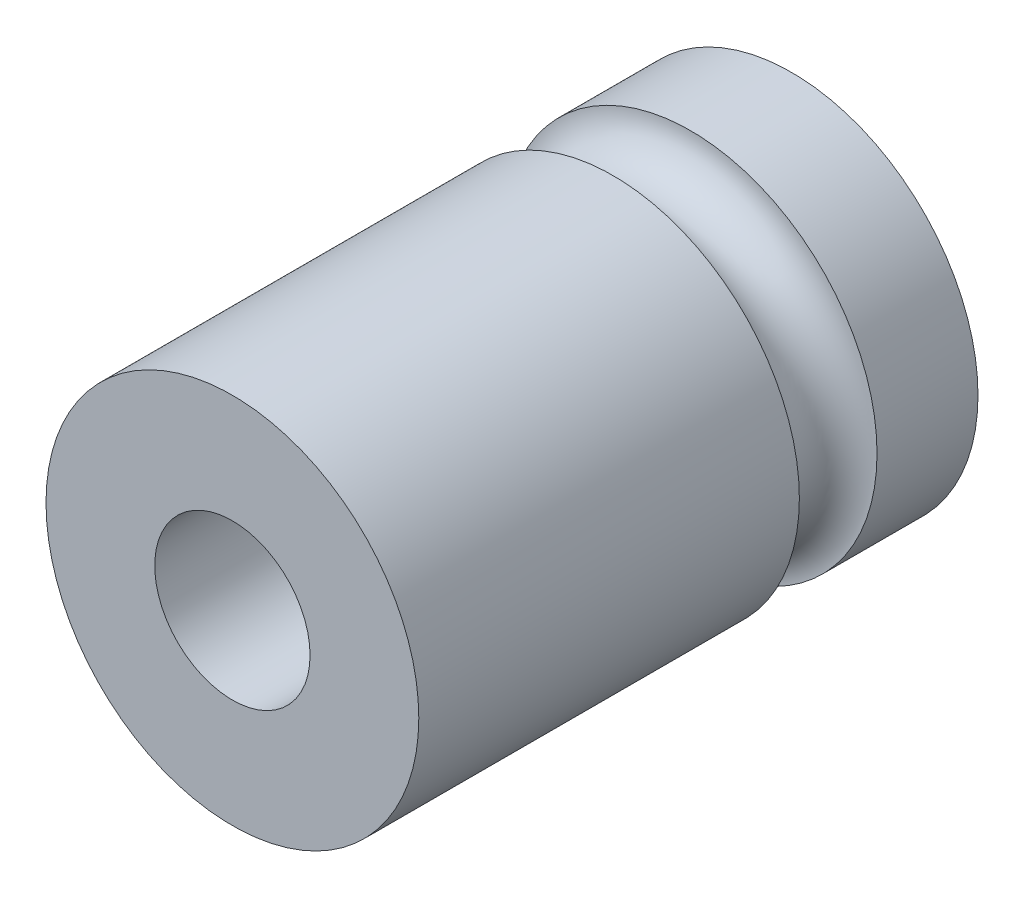
ISO-10303-21;
HEADER;
FILE_DESCRIPTION(('STEP AP214'),'2;1');
FILE_NAME('part.step','',(''),(''),'','','');
FILE_SCHEMA(('AUTOMOTIVE_DESIGN { 1 0 10303 214 1 1 1 1 }'));
ENDSEC;
DATA;
#1=APPLICATION_CONTEXT('core data for automotive mechanical design processes');
#2=APPLICATION_PROTOCOL_DEFINITION('international standard','automotive_design',2000,#1);
#3=PRODUCT_CONTEXT('',#1,'mechanical');
#4=PRODUCT('Part','Part','',(#3));
#5=PRODUCT_RELATED_PRODUCT_CATEGORY('part','',(#4));
#6=PRODUCT_DEFINITION_FORMATION('','',#4);
#7=PRODUCT_DEFINITION_CONTEXT('part definition',#1,'design');
#8=PRODUCT_DEFINITION('design','',#6,#7);
#9=PRODUCT_DEFINITION_SHAPE('','',#8);
#10=(LENGTH_UNIT() NAMED_UNIT(*) SI_UNIT(.MILLI.,.METRE.));
#11=(NAMED_UNIT(*) PLANE_ANGLE_UNIT() SI_UNIT($,.RADIAN.));
#12=(NAMED_UNIT(*) SI_UNIT($,.STERADIAN.) SOLID_ANGLE_UNIT());
#13=UNCERTAINTY_MEASURE_WITH_UNIT(LENGTH_MEASURE(1.E-05),#10,'distance_accuracy_value','');
#14=(GEOMETRIC_REPRESENTATION_CONTEXT(3) GLOBAL_UNCERTAINTY_ASSIGNED_CONTEXT((#13)) GLOBAL_UNIT_ASSIGNED_CONTEXT((#10,
#11,#12)) REPRESENTATION_CONTEXT('',''));
#15=CARTESIAN_POINT('',(0.,0.,0.));
#16=DIRECTION('',(0.,0.,1.));
#17=DIRECTION('',(1.,0.,0.));
#18=AXIS2_PLACEMENT_3D('',#15,#16,#17);
#19=CARTESIAN_POINT('',(0.,0.,5.715));
#20=DIRECTION('',(0.,0.,-1.));
#21=DIRECTION('',(-1.,0.,0.));
#22=AXIS2_PLACEMENT_3D('',#19,#20,#21);
#23=CYLINDRICAL_SURFACE('',#22,3.81);
#24=CARTESIAN_POINT('',(0.,0.,-2.06375));
#25=DIRECTION('',(0.,0.,-1.));
#26=DIRECTION('',(-1.,0.,0.));
#27=AXIS2_PLACEMENT_3D('',#24,#25,#26);
#28=CIRCLE('',#27,3.81);
#29=CARTESIAN_POINT('',(-3.81,0.,-2.06375));
#30=VERTEX_POINT('',#29);
#31=EDGE_CURVE('E37',#30,#30,#28,.F.);
#32=ORIENTED_EDGE('',*,*,#31,.T.);
#33=EDGE_LOOP('',(#32));
#34=FACE_BOUND('',#33,.T.);
#35=CARTESIAN_POINT('',(0.,0.,5.715));
#36=DIRECTION('',(0.,0.,1.));
#37=DIRECTION('',(1.,0.,0.));
#38=AXIS2_PLACEMENT_3D('',#35,#36,#37);
#39=CIRCLE('',#38,3.81);
#40=CARTESIAN_POINT('',(3.81,0.,5.715));
#41=VERTEX_POINT('',#40);
#42=EDGE_CURVE('E10',#41,#41,#39,.T.);
#43=ORIENTED_EDGE('',*,*,#42,.F.);
#44=EDGE_LOOP('',(#43));
#45=FACE_BOUND('',#44,.T.);
#46=ADVANCED_FACE('F33',(#34,#45),#23,.T.);
#47=CARTESIAN_POINT('',(0.,0.,5.715));
#48=DIRECTION('',(0.,0.,1.));
#49=DIRECTION('',(1.,0.,0.));
#50=AXIS2_PLACEMENT_3D('',#47,#48,#49);
#51=PLANE('',#50);
#52=ORIENTED_EDGE('',*,*,#42,.T.);
#53=EDGE_LOOP('',(#52));
#54=FACE_BOUND('',#53,.T.);
#55=CARTESIAN_POINT('',(0.,0.,5.715));
#56=DIRECTION('',(0.,0.,1.));
#57=DIRECTION('',(1.,0.,0.));
#58=AXIS2_PLACEMENT_3D('',#55,#56,#57);
#59=CIRCLE('',#58,1.5875);
#60=CARTESIAN_POINT('',(1.5875,0.,5.715));
#61=VERTEX_POINT('',#60);
#62=EDGE_CURVE('E46',#61,#61,#59,.T.);
#63=ORIENTED_EDGE('',*,*,#62,.F.);
#64=EDGE_LOOP('',(#63));
#65=FACE_BOUND('',#64,.T.);
#66=ADVANCED_FACE('F67',(#54,#65),#51,.T.);
#67=CARTESIAN_POINT('',(0.,0.,-5.715));
#68=DIRECTION('',(0.,0.,1.));
#69=DIRECTION('',(1.,0.,0.));
#70=AXIS2_PLACEMENT_3D('',#67,#68,#69);
#71=PLANE('',#70);
#72=CARTESIAN_POINT('',(0.,0.,-5.715));
#73=DIRECTION('',(0.,0.,1.));
#74=DIRECTION('',(1.,0.,0.));
#75=AXIS2_PLACEMENT_3D('',#72,#73,#74);
#76=CIRCLE('',#75,3.81);
#77=CARTESIAN_POINT('',(3.81,0.,-5.715));
#78=VERTEX_POINT('',#77);
#79=EDGE_CURVE('E41',#78,#78,#76,.T.);
#80=ORIENTED_EDGE('',*,*,#79,.F.);
#81=EDGE_LOOP('',(#80));
#82=FACE_BOUND('',#81,.T.);
#83=CARTESIAN_POINT('',(0.,0.,-5.715));
#84=DIRECTION('',(0.,0.,1.));
#85=DIRECTION('',(1.,0.,0.));
#86=AXIS2_PLACEMENT_3D('',#83,#84,#85);
#87=CIRCLE('',#86,1.5875);
#88=CARTESIAN_POINT('',(1.5875,0.,-5.715));
#89=VERTEX_POINT('',#88);
#90=EDGE_CURVE('E49',#89,#89,#87,.T.);
#91=ORIENTED_EDGE('',*,*,#90,.T.);
#92=EDGE_LOOP('',(#91));
#93=FACE_BOUND('',#92,.T.);
#94=ADVANCED_FACE('F69',(#82,#93),#71,.F.);
#95=CARTESIAN_POINT('',(0.,0.,-3.65125));
#96=DIRECTION('',(0.,0.,1.));
#97=DIRECTION('',(1.,0.,0.));
#98=AXIS2_PLACEMENT_3D('',#95,#96,#97);
#99=CIRCLE('',#98,3.81);
#100=CARTESIAN_POINT('',(3.81,0.,-3.65125));
#101=VERTEX_POINT('',#100);
#102=EDGE_CURVE('E51',#101,#101,#99,.F.);
#103=ORIENTED_EDGE('',*,*,#102,.T.);
#104=EDGE_LOOP('',(#103));
#105=FACE_BOUND('',#104,.T.);
#106=ORIENTED_EDGE('',*,*,#79,.T.);
#107=EDGE_LOOP('',(#106));
#108=FACE_BOUND('',#107,.T.);
#109=ADVANCED_FACE('F35',(#105,#108),#23,.T.);
#110=CARTESIAN_POINT('',(0.,0.,5.715));
#111=DIRECTION('',(0.,0.,-1.));
#112=DIRECTION('',(-1.,0.,0.));
#113=AXIS2_PLACEMENT_3D('',#110,#111,#112);
#114=CYLINDRICAL_SURFACE('',#113,1.5875);
#115=ORIENTED_EDGE('',*,*,#62,.T.);
#116=EDGE_LOOP('',(#115));
#117=FACE_BOUND('',#116,.T.);
#118=ORIENTED_EDGE('',*,*,#90,.F.);
#119=EDGE_LOOP('',(#118));
#120=FACE_BOUND('',#119,.T.);
#121=ADVANCED_FACE('F64',(#117,#120),#114,.F.);
#122=CARTESIAN_POINT('',(0.,0.,-2.8575));
#123=DIRECTION('',(0.,0.,1.));
#124=DIRECTION('',(1.,0.,0.));
#125=AXIS2_PLACEMENT_3D('',#122,#123,#124);
#126=TOROIDAL_SURFACE('',#125,3.81,0.793750000000001);
#127=ORIENTED_EDGE('',*,*,#102,.F.);
#128=EDGE_LOOP('',(#127));
#129=FACE_BOUND('',#128,.T.);
#130=ORIENTED_EDGE('',*,*,#31,.F.);
#131=EDGE_LOOP('',(#130));
#132=FACE_BOUND('',#131,.T.);
#133=ADVANCED_FACE('F79',(#129,#132),#126,.F.);
#134=CLOSED_SHELL('',(#46,#66,#94,#109,#121,#133));
#135=MANIFOLD_SOLID_BREP('B2',#134);
#136=ADVANCED_BREP_SHAPE_REPRESENTATION('',(#18,#135),#14);
#137=SHAPE_DEFINITION_REPRESENTATION(#9,#136);
ENDSEC;
END-ISO-10303-21;
